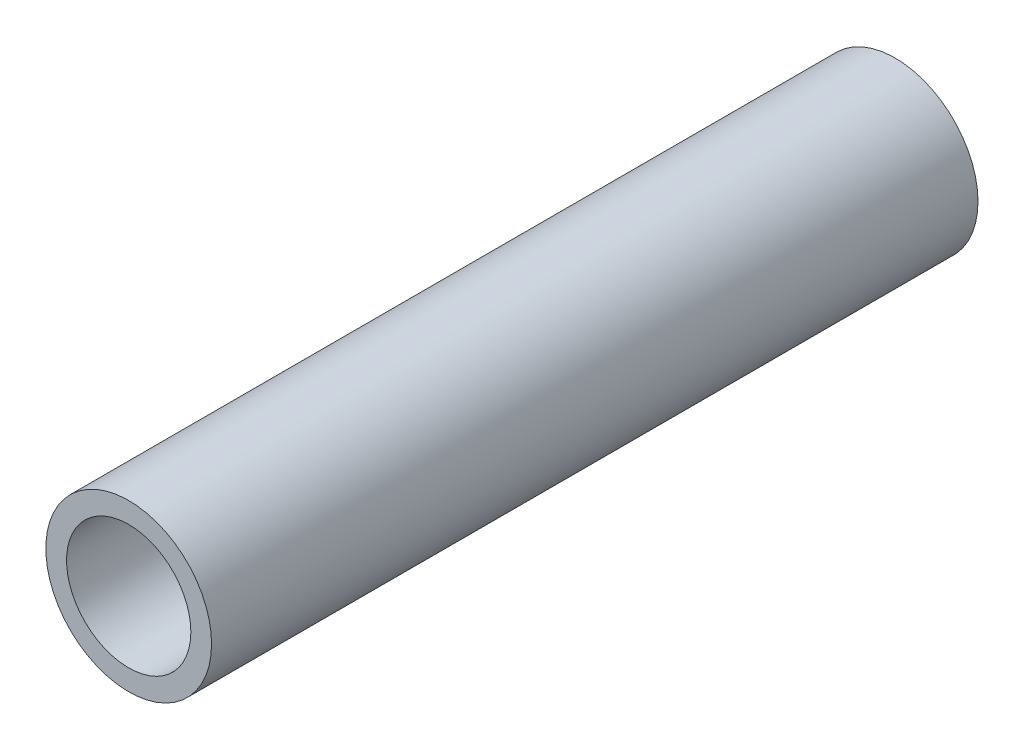
ISO-10303-21;
HEADER;
FILE_DESCRIPTION(('STEP AP214'),'2;1');
FILE_NAME('part.step','',(''),(''),'','','');
FILE_SCHEMA(('AUTOMOTIVE_DESIGN { 1 0 10303 214 1 1 1 1 }'));
ENDSEC;
DATA;
#1=APPLICATION_CONTEXT('core data for automotive mechanical design processes');
#2=APPLICATION_PROTOCOL_DEFINITION('international standard','automotive_design',2000,#1);
#3=PRODUCT_CONTEXT('',#1,'mechanical');
#4=PRODUCT('Part','Part','',(#3));
#5=PRODUCT_RELATED_PRODUCT_CATEGORY('part','',(#4));
#6=PRODUCT_DEFINITION_FORMATION('','',#4);
#7=PRODUCT_DEFINITION_CONTEXT('part definition',#1,'design');
#8=PRODUCT_DEFINITION('design','',#6,#7);
#9=PRODUCT_DEFINITION_SHAPE('','',#8);
#10=(LENGTH_UNIT() NAMED_UNIT(*) SI_UNIT(.MILLI.,.METRE.));
#11=(NAMED_UNIT(*) PLANE_ANGLE_UNIT() SI_UNIT($,.RADIAN.));
#12=(NAMED_UNIT(*) SI_UNIT($,.STERADIAN.) SOLID_ANGLE_UNIT());
#13=UNCERTAINTY_MEASURE_WITH_UNIT(LENGTH_MEASURE(1.E-05),#10,'distance_accuracy_value','');
#14=(GEOMETRIC_REPRESENTATION_CONTEXT(3) GLOBAL_UNCERTAINTY_ASSIGNED_CONTEXT((#13)) GLOBAL_UNIT_ASSIGNED_CONTEXT((#10,
#11,#12)) REPRESENTATION_CONTEXT('',''));
#15=CARTESIAN_POINT('',(0.,0.,0.));
#16=DIRECTION('',(0.,0.,1.));
#17=DIRECTION('',(1.,0.,0.));
#18=AXIS2_PLACEMENT_3D('',#15,#16,#17);
#19=CARTESIAN_POINT('',(0.,0.,74.));
#20=DIRECTION('',(0.,0.,1.));
#21=DIRECTION('',(1.,0.,0.));
#22=AXIS2_PLACEMENT_3D('',#19,#20,#21);
#23=PLANE('',#22);
#24=CARTESIAN_POINT('',(0.,0.,74.));
#25=DIRECTION('',(0.,0.,1.));
#26=DIRECTION('',(1.,0.,0.));
#27=AXIS2_PLACEMENT_3D('',#24,#25,#26);
#28=CIRCLE('',#27,8.);
#29=CARTESIAN_POINT('',(8.,0.,74.));
#30=VERTEX_POINT('',#29);
#31=EDGE_CURVE('E10',#30,#30,#28,.T.);
#32=ORIENTED_EDGE('',*,*,#31,.T.);
#33=EDGE_LOOP('',(#32));
#34=FACE_BOUND('',#33,.T.);
#35=CARTESIAN_POINT('',(0.,0.,74.));
#36=DIRECTION('',(0.,0.,1.));
#37=DIRECTION('',(1.,0.,0.));
#38=AXIS2_PLACEMENT_3D('',#35,#36,#37);
#39=CIRCLE('',#38,6.);
#40=CARTESIAN_POINT('',(6.,0.,74.));
#41=VERTEX_POINT('',#40);
#42=EDGE_CURVE('E56',#41,#41,#39,.T.);
#43=ORIENTED_EDGE('',*,*,#42,.F.);
#44=EDGE_LOOP('',(#43));
#45=FACE_BOUND('',#44,.T.);
#46=ADVANCED_FACE('F43',(#34,#45),#23,.T.);
#47=CARTESIAN_POINT('',(0.,0.,0.));
#48=DIRECTION('',(0.,0.,1.));
#49=DIRECTION('',(1.,0.,0.));
#50=AXIS2_PLACEMENT_3D('',#47,#48,#49);
#51=PLANE('',#50);
#52=CARTESIAN_POINT('',(0.,0.,0.));
#53=DIRECTION('',(0.,0.,1.));
#54=DIRECTION('',(1.,0.,0.));
#55=AXIS2_PLACEMENT_3D('',#52,#53,#54);
#56=CIRCLE('',#55,8.);
#57=CARTESIAN_POINT('',(8.,0.,0.));
#58=VERTEX_POINT('',#57);
#59=EDGE_CURVE('E47',#58,#58,#56,.T.);
#60=ORIENTED_EDGE('',*,*,#59,.F.);
#61=EDGE_LOOP('',(#60));
#62=FACE_BOUND('',#61,.T.);
#63=CARTESIAN_POINT('',(0.,0.,0.));
#64=DIRECTION('',(0.,0.,1.));
#65=DIRECTION('',(1.,0.,0.));
#66=AXIS2_PLACEMENT_3D('',#63,#64,#65);
#67=CIRCLE('',#66,6.);
#68=CARTESIAN_POINT('',(6.,0.,0.));
#69=VERTEX_POINT('',#68);
#70=EDGE_CURVE('E58',#69,#69,#67,.T.);
#71=ORIENTED_EDGE('',*,*,#70,.T.);
#72=EDGE_LOOP('',(#71));
#73=FACE_BOUND('',#72,.T.);
#74=ADVANCED_FACE('F70',(#62,#73),#51,.F.);
#75=CARTESIAN_POINT('',(0.,0.,74.));
#76=DIRECTION('',(0.,0.,-1.));
#77=DIRECTION('',(-1.,0.,0.));
#78=AXIS2_PLACEMENT_3D('',#75,#76,#77);
#79=CYLINDRICAL_SURFACE('',#78,8.);
#80=ORIENTED_EDGE('',*,*,#31,.F.);
#81=EDGE_LOOP('',(#80));
#82=FACE_BOUND('',#81,.T.);
#83=ORIENTED_EDGE('',*,*,#59,.T.);
#84=EDGE_LOOP('',(#83));
#85=FACE_BOUND('',#84,.T.);
#86=ADVANCED_FACE('F45',(#82,#85),#79,.T.);
#87=CARTESIAN_POINT('',(0.,0.,74.));
#88=DIRECTION('',(0.,0.,-1.));
#89=DIRECTION('',(-1.,0.,0.));
#90=AXIS2_PLACEMENT_3D('',#87,#88,#89);
#91=CYLINDRICAL_SURFACE('',#90,6.);
#92=ORIENTED_EDGE('',*,*,#42,.T.);
#93=EDGE_LOOP('',(#92));
#94=FACE_BOUND('',#93,.T.);
#95=ORIENTED_EDGE('',*,*,#70,.F.);
#96=EDGE_LOOP('',(#95));
#97=FACE_BOUND('',#96,.T.);
#98=ADVANCED_FACE('F66',(#94,#97),#91,.F.);
#99=CLOSED_SHELL('',(#46,#74,#86,#98));
#100=MANIFOLD_SOLID_BREP('B2',#99);
#101=ADVANCED_BREP_SHAPE_REPRESENTATION('',(#18,#100),#14);
#102=SHAPE_DEFINITION_REPRESENTATION(#9,#101);
ENDSEC;
END-ISO-10303-21;
